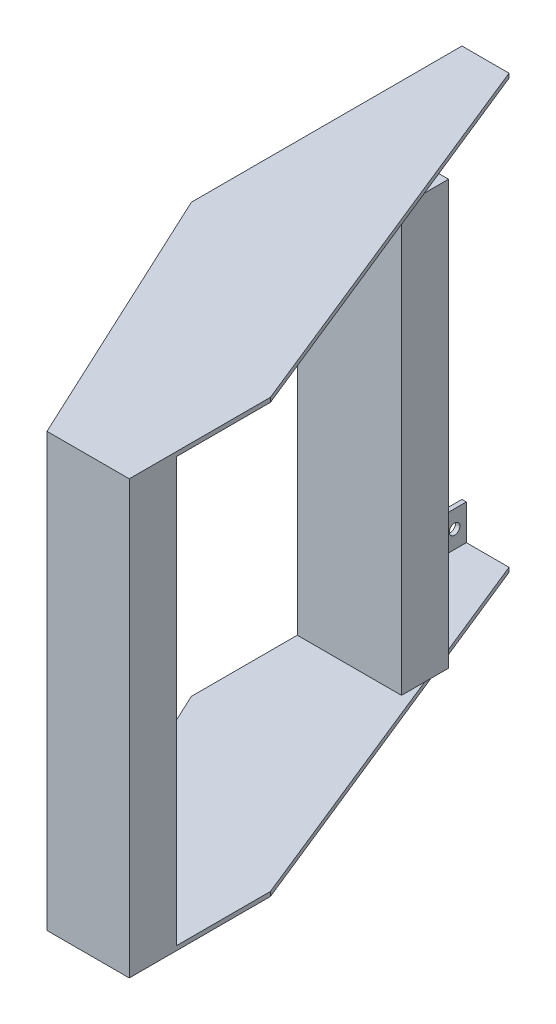
ISO-10303-21;
HEADER;
FILE_DESCRIPTION(('STEP AP214'),'2;1');
FILE_NAME('part.step','',(''),(''),'','','');
FILE_SCHEMA(('AUTOMOTIVE_DESIGN { 1 0 10303 214 1 1 1 1 }'));
ENDSEC;
DATA;
#1=APPLICATION_CONTEXT('core data for automotive mechanical design processes');
#2=APPLICATION_PROTOCOL_DEFINITION('international standard','automotive_design',2000,#1);
#3=PRODUCT_CONTEXT('',#1,'mechanical');
#4=PRODUCT('Part','Part','',(#3));
#5=PRODUCT_RELATED_PRODUCT_CATEGORY('part','',(#4));
#6=PRODUCT_DEFINITION_FORMATION('','',#4);
#7=PRODUCT_DEFINITION_CONTEXT('part definition',#1,'design');
#8=PRODUCT_DEFINITION('design','',#6,#7);
#9=PRODUCT_DEFINITION_SHAPE('','',#8);
#10=(LENGTH_UNIT() NAMED_UNIT(*) SI_UNIT(.MILLI.,.METRE.));
#11=(NAMED_UNIT(*) PLANE_ANGLE_UNIT() SI_UNIT($,.RADIAN.));
#12=(NAMED_UNIT(*) SI_UNIT($,.STERADIAN.) SOLID_ANGLE_UNIT());
#13=UNCERTAINTY_MEASURE_WITH_UNIT(LENGTH_MEASURE(1.E-05),#10,'distance_accuracy_value','');
#14=(GEOMETRIC_REPRESENTATION_CONTEXT(3) GLOBAL_UNCERTAINTY_ASSIGNED_CONTEXT((#13)) GLOBAL_UNIT_ASSIGNED_CONTEXT((#10,
#11,#12)) REPRESENTATION_CONTEXT('',''));
#15=CARTESIAN_POINT('',(0.,0.,0.));
#16=DIRECTION('',(0.,0.,1.));
#17=DIRECTION('',(1.,0.,0.));
#18=AXIS2_PLACEMENT_3D('',#15,#16,#17);
#19=CARTESIAN_POINT('',(0.,4.7498,0.));
#20=DIRECTION('',(0.,1.,0.));
#21=DIRECTION('',(0.,0.,1.));
#22=AXIS2_PLACEMENT_3D('',#19,#20,#21);
#23=PLANE('',#22);
#24=DIRECTION('',(0.422618261740695,0.,0.906307787036652));
#25=VECTOR('',#24,1.);
#26=CARTESIAN_POINT('',(23.6864669470732,4.7498,292.1));
#27=LINE('',#26,#25);
#28=CARTESIAN_POINT('',(-112.522000000001,4.7498,-1.16416580186276E-12));
#29=VERTEX_POINT('',#28);
#30=CARTESIAN_POINT('',(23.6864669470732,4.7498,292.1));
#31=VERTEX_POINT('',#30);
#32=EDGE_CURVE('E459',#29,#31,#27,.T.);
#33=ORIENTED_EDGE('',*,*,#32,.T.);
#34=DIRECTION('',(0.,0.,1.));
#35=VECTOR('',#34,1.);
#36=CARTESIAN_POINT('',(23.6864669470732,4.7498,292.1));
#37=LINE('',#36,#35);
#38=CARTESIAN_POINT('',(23.6864669470732,4.7498,241.3));
#39=VERTEX_POINT('',#38);
#40=EDGE_CURVE('E372',#39,#31,#37,.T.);
#41=ORIENTED_EDGE('',*,*,#40,.F.);
#42=DIRECTION('',(-1.,0.,0.));
#43=VECTOR('',#42,1.);
#44=CARTESIAN_POINT('',(23.6864669470732,4.7498,241.3));
#45=LINE('',#44,#43);
#46=CARTESIAN_POINT('',(112.522,4.7498,241.3));
#47=VERTEX_POINT('',#46);
#48=EDGE_CURVE('E218',#47,#39,#45,.T.);
#49=ORIENTED_EDGE('',*,*,#48,.F.);
#50=DIRECTION('',(0.,0.,-1.));
#51=VECTOR('',#50,1.);
#52=CARTESIAN_POINT('',(112.522,4.7498,292.099999999996));
#53=LINE('',#52,#51);
#54=CARTESIAN_POINT('',(112.521999999999,4.7498,139.7));
#55=VERTEX_POINT('',#54);
#56=EDGE_CURVE('E463',#47,#55,#53,.T.);
#57=ORIENTED_EDGE('',*,*,#56,.T.);
#58=DIRECTION('',(-0.37421049431943,0.,-0.927343790587508));
#59=VECTOR('',#58,1.);
#60=CARTESIAN_POINT('',(-61.7220000000018,4.7498,-292.100000000003));
#61=LINE('',#60,#59);
#62=CARTESIAN_POINT('',(0.,4.7498,-139.144606413993));
#63=VERTEX_POINT('',#62);
#64=EDGE_CURVE('E467',#55,#63,#61,.T.);
#65=ORIENTED_EDGE('',*,*,#64,.T.);
#66=DIRECTION('',(0.,0.,-1.));
#67=VECTOR('',#66,1.);
#68=CARTESIAN_POINT('',(0.,4.7498,-165.100000000003));
#69=LINE('',#68,#67);
#70=CARTESIAN_POINT('',(0.,4.7498,-114.300000000003));
#71=VERTEX_POINT('',#70);
#72=EDGE_CURVE('E428',#71,#63,#69,.T.);
#73=ORIENTED_EDGE('',*,*,#72,.F.);
#74=DIRECTION('',(1.,0.,0.));
#75=VECTOR('',#74,1.);
#76=CARTESIAN_POINT('',(-112.522000000001,4.7498,-114.300000000003));
#77=LINE('',#76,#75);
#78=CARTESIAN_POINT('',(-112.522000000001,4.7498,-114.300000000003));
#79=VERTEX_POINT('',#78);
#80=EDGE_CURVE('E416',#79,#71,#77,.T.);
#81=ORIENTED_EDGE('',*,*,#80,.F.);
#82=DIRECTION('',(0.,0.,1.));
#83=VECTOR('',#82,1.);
#84=CARTESIAN_POINT('',(-112.522000000001,4.7498,-1.16416580186276E-12));
#85=LINE('',#84,#83);
#86=EDGE_CURVE('E455',#79,#29,#85,.T.);
#87=ORIENTED_EDGE('',*,*,#86,.T.);
#88=EDGE_LOOP('',(#33,#41,#49,#57,#65,#73,#81,#87));
#89=FACE_BOUND('',#88,.T.);
#90=ADVANCED_FACE('F51',(#89),#23,.T.);
#91=DIRECTION('',(-1.,0.,0.));
#92=VECTOR('',#91,1.);
#93=CARTESIAN_POINT('',(-112.522000000001,4.7498,-292.100000000003));
#94=LINE('',#93,#92);
#95=CARTESIAN_POINT('',(-61.7220000000018,4.7498,-292.100000000003));
#96=VERTEX_POINT('',#95);
#97=CARTESIAN_POINT('',(-107.772200000001,4.7498,-292.100000000003));
#98=VERTEX_POINT('',#97);
#99=EDGE_CURVE('E451',#96,#98,#94,.T.);
#100=ORIENTED_EDGE('',*,*,#99,.T.);
#101=DIRECTION('',(0.,0.,-1.));
#102=VECTOR('',#101,1.);
#103=CARTESIAN_POINT('',(-107.772200000001,4.7498,0.));
#104=LINE('',#103,#102);
#105=CARTESIAN_POINT('',(-107.772200000001,4.7498,-165.100000000003));
#106=VERTEX_POINT('',#105);
#107=EDGE_CURVE('E387',#106,#98,#104,.T.);
#108=ORIENTED_EDGE('',*,*,#107,.F.);
#109=DIRECTION('',(-1.,0.,0.));
#110=VECTOR('',#109,1.);
#111=CARTESIAN_POINT('',(-112.522000000001,4.7498,-165.100000000003));
#112=LINE('',#111,#110);
#113=CARTESIAN_POINT('',(-10.4737647058841,4.7498,-165.100000000003));
#114=VERTEX_POINT('',#113);
#115=EDGE_CURVE('E11',#114,#106,#112,.T.);
#116=ORIENTED_EDGE('',*,*,#115,.F.);
#117=EDGE_CURVE('E466',#114,#96,#61,.T.);
#118=ORIENTED_EDGE('',*,*,#117,.T.);
#119=EDGE_LOOP('',(#100,#108,#116,#118));
#120=FACE_BOUND('',#119,.T.);
#121=ADVANCED_FACE('F587',(#120),#23,.T.);
#122=CARTESIAN_POINT('',(-112.522000000001,4.7498,-292.100000000003));
#123=DIRECTION('',(0.,0.,1.));
#124=DIRECTION('',(1.,0.,0.));
#125=AXIS2_PLACEMENT_3D('',#122,#123,#124);
#126=PLANE('',#125);
#127=DIRECTION('',(-1.,0.,0.));
#128=VECTOR('',#127,1.);
#129=CARTESIAN_POINT('',(-112.522000000001,0.,-292.100000000003));
#130=LINE('',#129,#128);
#131=CARTESIAN_POINT('',(-61.7220000000018,0.,-292.100000000003));
#132=VERTEX_POINT('',#131);
#133=CARTESIAN_POINT('',(-112.522000000001,0.,-292.100000000003));
#134=VERTEX_POINT('',#133);
#135=EDGE_CURVE('E450',#132,#134,#130,.T.);
#136=ORIENTED_EDGE('',*,*,#135,.T.);
#137=DIRECTION('',(0.,-1.,0.));
#138=VECTOR('',#137,1.);
#139=CARTESIAN_POINT('',(-112.522000000001,4.7498,-292.100000000003));
#140=LINE('',#139,#138);
#141=CARTESIAN_POINT('',(-112.522000000001,42.8498,-292.100000000003));
#142=VERTEX_POINT('',#141);
#143=EDGE_CURVE('E55',#142,#134,#140,.T.);
#144=ORIENTED_EDGE('',*,*,#143,.F.);
#145=DIRECTION('',(-1.,0.,0.));
#146=VECTOR('',#145,1.);
#147=CARTESIAN_POINT('',(-107.772200000001,42.8498,-292.100000000003));
#148=LINE('',#147,#146);
#149=CARTESIAN_POINT('',(-107.772200000001,42.8498,-292.100000000003));
#150=VERTEX_POINT('',#149);
#151=EDGE_CURVE('E398',#150,#142,#148,.T.);
#152=ORIENTED_EDGE('',*,*,#151,.F.);
#153=DIRECTION('',(0.,1.,0.));
#154=VECTOR('',#153,1.);
#155=CARTESIAN_POINT('',(-107.772200000001,4.25585492772981E-13,-292.100000000003));
#156=LINE('',#155,#154);
#157=EDGE_CURVE('E384',#98,#150,#156,.T.);
#158=ORIENTED_EDGE('',*,*,#157,.F.);
#159=ORIENTED_EDGE('',*,*,#99,.F.);
#160=DIRECTION('',(0.,-1.,0.));
#161=VECTOR('',#160,1.);
#162=CARTESIAN_POINT('',(-61.7220000000018,4.7498,-292.100000000003));
#163=LINE('',#162,#161);
#164=EDGE_CURVE('E471',#96,#132,#163,.T.);
#165=ORIENTED_EDGE('',*,*,#164,.T.);
#166=EDGE_LOOP('',(#136,#144,#152,#158,#159,#165));
#167=FACE_BOUND('',#166,.T.);
#168=ADVANCED_FACE('F53',(#167),#126,.F.);
#169=CARTESIAN_POINT('',(-112.522000000001,4.7498,-1.16416580186276E-12));
#170=DIRECTION('',(1.,0.,0.));
#171=DIRECTION('',(0.,0.,-1.));
#172=AXIS2_PLACEMENT_3D('',#169,#170,#171);
#173=PLANE('',#172);
#174=DIRECTION('',(0.,0.,1.));
#175=VECTOR('',#174,1.);
#176=CARTESIAN_POINT('',(-112.522000000001,0.,-1.16416580186276E-12));
#177=LINE('',#176,#175);
#178=CARTESIAN_POINT('',(-112.522000000001,0.,-1.16416580186276E-12));
#179=VERTEX_POINT('',#178);
#180=EDGE_CURVE('E476',#134,#179,#177,.T.);
#181=ORIENTED_EDGE('',*,*,#180,.T.);
#182=DIRECTION('',(0.,-1.,0.));
#183=VECTOR('',#182,1.);
#184=CARTESIAN_POINT('',(-112.522000000001,4.7498,-1.16416580186276E-12));
#185=LINE('',#184,#183);
#186=EDGE_CURVE('E504',#29,#179,#185,.T.);
#187=ORIENTED_EDGE('',*,*,#186,.F.);
#188=ORIENTED_EDGE('',*,*,#86,.F.);
#189=DIRECTION('',(0.,-1.,0.));
#190=VECTOR('',#189,1.);
#191=CARTESIAN_POINT('',(-112.522000000001,233.3498,-114.300000000003));
#192=LINE('',#191,#190);
#193=CARTESIAN_POINT('',(-112.522000000001,461.9498,-114.300000000003));
#194=VERTEX_POINT('',#193);
#195=EDGE_CURVE('E446',#194,#79,#192,.T.);
#196=ORIENTED_EDGE('',*,*,#195,.F.);
#197=DIRECTION('',(0.,0.,1.));
#198=VECTOR('',#197,1.);
#199=CARTESIAN_POINT('',(-112.522000000001,461.9498,-1.16416580186276E-12));
#200=LINE('',#199,#198);
#201=CARTESIAN_POINT('',(-112.522000000001,461.9498,-1.16416580186276E-12));
#202=VERTEX_POINT('',#201);
#203=EDGE_CURVE('E309',#194,#202,#200,.T.);
#204=ORIENTED_EDGE('',*,*,#203,.T.);
#205=DIRECTION('',(0.,1.,0.));
#206=VECTOR('',#205,1.);
#207=CARTESIAN_POINT('',(-112.522000000001,461.9498,-1.16416580186276E-12));
#208=LINE('',#207,#206);
#209=CARTESIAN_POINT('',(-112.522000000001,466.6996,-1.16416580186276E-12));
#210=VERTEX_POINT('',#209);
#211=EDGE_CURVE('E358',#202,#210,#208,.T.);
#212=ORIENTED_EDGE('',*,*,#211,.T.);
#213=DIRECTION('',(0.,0.,1.));
#214=VECTOR('',#213,1.);
#215=CARTESIAN_POINT('',(-112.522000000001,466.6996,-1.16416580186276E-12));
#216=LINE('',#215,#214);
#217=CARTESIAN_POINT('',(-112.522000000001,466.6996,-292.100000000003));
#218=VERTEX_POINT('',#217);
#219=EDGE_CURVE('E329',#218,#210,#216,.T.);
#220=ORIENTED_EDGE('',*,*,#219,.F.);
#221=DIRECTION('',(0.,1.,0.));
#222=VECTOR('',#221,1.);
#223=CARTESIAN_POINT('',(-112.522000000001,461.9498,-292.100000000003));
#224=LINE('',#223,#222);
#225=CARTESIAN_POINT('',(-112.522000000001,423.8498,-292.100000000003));
#226=VERTEX_POINT('',#225);
#227=EDGE_CURVE('E362',#226,#218,#224,.T.);
#228=ORIENTED_EDGE('',*,*,#227,.F.);
#229=DIRECTION('',(0.,0.,1.));
#230=VECTOR('',#229,1.);
#231=CARTESIAN_POINT('',(-112.522000000001,423.8498,0.));
#232=LINE('',#231,#230);
#233=CARTESIAN_POINT('',(-112.522000000001,423.8498,-219.512439056878));
#234=VERTEX_POINT('',#233);
#235=EDGE_CURVE('E270',#226,#234,#232,.T.);
#236=ORIENTED_EDGE('',*,*,#235,.T.);
#237=DIRECTION('',(0.,-0.573576436351042,-0.819152044288995));
#238=VECTOR('',#237,1.);
#239=CARTESIAN_POINT('',(-112.522000000001,541.084062207494,-52.0845611633618));
#240=LINE('',#239,#238);
#241=CARTESIAN_POINT('',(-112.522000000001,461.9498,-165.100000000003));
#242=VERTEX_POINT('',#241);
#243=EDGE_CURVE('E274',#242,#234,#240,.T.);
#244=ORIENTED_EDGE('',*,*,#243,.F.);
#245=DIRECTION('',(0.,-1.,0.));
#246=VECTOR('',#245,1.);
#247=CARTESIAN_POINT('',(-112.522000000001,233.3498,-165.100000000003));
#248=LINE('',#247,#246);
#249=CARTESIAN_POINT('',(-112.522000000001,4.7498,-165.100000000003));
#250=VERTEX_POINT('',#249);
#251=EDGE_CURVE('E434',#242,#250,#248,.T.);
#252=ORIENTED_EDGE('',*,*,#251,.T.);
#253=DIRECTION('',(0.,0.573576436351042,-0.819152044288995));
#254=VECTOR('',#253,1.);
#255=CARTESIAN_POINT('',(-112.522000000001,-74.3844622074936,-52.0845611633618));
#256=LINE('',#255,#254);
#257=CARTESIAN_POINT('',(-112.522000000001,42.8498,-219.512439056878));
#258=VERTEX_POINT('',#257);
#259=EDGE_CURVE('E406',#250,#258,#256,.T.);
#260=ORIENTED_EDGE('',*,*,#259,.T.);
#261=DIRECTION('',(0.,0.,1.));
#262=VECTOR('',#261,1.);
#263=CARTESIAN_POINT('',(-112.522000000001,42.8497999999999,0.));
#264=LINE('',#263,#262);
#265=EDGE_CURVE('E402',#142,#258,#264,.T.);
#266=ORIENTED_EDGE('',*,*,#265,.F.);
#267=ORIENTED_EDGE('',*,*,#143,.T.);
#268=EDGE_LOOP('',(#181,#187,#188,#196,#204,#212,#220,#228,#236,#244,#252,#260,#266,#267));
#269=FACE_BOUND('',#268,.T.);
#270=CARTESIAN_POINT('',(-112.522000000001,23.7998,-279.400000000003));
#271=DIRECTION('',(-1.,0.,0.));
#272=DIRECTION('',(0.,0.,1.));
#273=AXIS2_PLACEMENT_3D('',#270,#271,#272);
#274=CIRCLE('',#273,5.71500000000004);
#275=CARTESIAN_POINT('',(-112.522000000001,23.7998,-273.685000000003));
#276=VERTEX_POINT('',#275);
#277=EDGE_CURVE('E375',#276,#276,#274,.F.);
#278=ORIENTED_EDGE('',*,*,#277,.T.);
#279=EDGE_LOOP('',(#278));
#280=FACE_BOUND('',#279,.T.);
#281=CARTESIAN_POINT('',(-112.522000000001,23.7998,-228.600000000003));
#282=DIRECTION('',(-1.,0.,0.));
#283=DIRECTION('',(0.,0.,1.));
#284=AXIS2_PLACEMENT_3D('',#281,#282,#283);
#285=CIRCLE('',#284,5.71499999999998);
#286=CARTESIAN_POINT('',(-112.522000000001,23.7998,-222.885000000003));
#287=VERTEX_POINT('',#286);
#288=EDGE_CURVE('E381',#287,#287,#285,.F.);
#289=ORIENTED_EDGE('',*,*,#288,.T.);
#290=EDGE_LOOP('',(#289));
#291=FACE_BOUND('',#290,.T.);
#292=CARTESIAN_POINT('',(-112.522000000001,442.8998,-279.400000000003));
#293=DIRECTION('',(1.,0.,0.));
#294=DIRECTION('',(0.,0.,1.));
#295=AXIS2_PLACEMENT_3D('',#292,#293,#294);
#296=CIRCLE('',#295,5.71500000000004);
#297=CARTESIAN_POINT('',(-112.522000000001,442.8998,-273.685000000003));
#298=VERTEX_POINT('',#297);
#299=EDGE_CURVE('E233',#298,#298,#296,.F.);
#300=ORIENTED_EDGE('',*,*,#299,.F.);
#301=EDGE_LOOP('',(#300));
#302=FACE_BOUND('',#301,.T.);
#303=CARTESIAN_POINT('',(-112.522000000001,442.8998,-228.600000000003));
#304=DIRECTION('',(1.,0.,0.));
#305=DIRECTION('',(0.,0.,1.));
#306=AXIS2_PLACEMENT_3D('',#303,#304,#305);
#307=CIRCLE('',#306,5.71499999999998);
#308=CARTESIAN_POINT('',(-112.522000000001,442.8998,-222.885000000003));
#309=VERTEX_POINT('',#308);
#310=EDGE_CURVE('E247',#309,#309,#307,.F.);
#311=ORIENTED_EDGE('',*,*,#310,.F.);
#312=EDGE_LOOP('',(#311));
#313=FACE_BOUND('',#312,.T.);
#314=ADVANCED_FACE('F515',(#269,#280,#291,#302,#313),#173,.F.);
#315=CARTESIAN_POINT('',(23.6864669470732,4.7498,292.1));
#316=DIRECTION('',(0.906307787036652,0.,-0.422618261740695));
#317=DIRECTION('',(-0.422618261740695,0.,-0.906307787036652));
#318=AXIS2_PLACEMENT_3D('',#315,#316,#317);
#319=PLANE('',#318);
#320=DIRECTION('',(0.422618261740695,0.,0.906307787036652));
#321=VECTOR('',#320,1.);
#322=CARTESIAN_POINT('',(23.6864669470732,0.,292.1));
#323=LINE('',#322,#321);
#324=CARTESIAN_POINT('',(23.6864669470732,0.,292.1));
#325=VERTEX_POINT('',#324);
#326=EDGE_CURVE('E479',#179,#325,#323,.T.);
#327=ORIENTED_EDGE('',*,*,#326,.T.);
#328=DIRECTION('',(0.,-1.,0.));
#329=VECTOR('',#328,1.);
#330=CARTESIAN_POINT('',(23.6864669470732,4.7498,292.1));
#331=LINE('',#330,#329);
#332=EDGE_CURVE('E501',#31,#325,#331,.T.);
#333=ORIENTED_EDGE('',*,*,#332,.F.);
#334=ORIENTED_EDGE('',*,*,#32,.F.);
#335=ORIENTED_EDGE('',*,*,#186,.T.);
#336=EDGE_LOOP('',(#327,#333,#334,#335));
#337=FACE_BOUND('',#336,.T.);
#338=ADVANCED_FACE('F528',(#337),#319,.F.);
#339=CARTESIAN_POINT('',(23.6864669470732,4.7498,292.1));
#340=DIRECTION('',(0.,0.,-1.));
#341=DIRECTION('',(-1.,0.,0.));
#342=AXIS2_PLACEMENT_3D('',#339,#340,#341);
#343=PLANE('',#342);
#344=DIRECTION('',(1.,0.,0.));
#345=VECTOR('',#344,1.);
#346=CARTESIAN_POINT('',(23.6864669470732,0.,292.1));
#347=LINE('',#346,#345);
#348=CARTESIAN_POINT('',(112.522,0.,292.099999999996));
#349=VERTEX_POINT('',#348);
#350=EDGE_CURVE('E482',#325,#349,#347,.T.);
#351=ORIENTED_EDGE('',*,*,#350,.T.);
#352=DIRECTION('',(0.,-1.,0.));
#353=VECTOR('',#352,1.);
#354=CARTESIAN_POINT('',(112.522,4.7498,292.099999999996));
#355=LINE('',#354,#353);
#356=CARTESIAN_POINT('',(112.522,466.6996,292.099999999996));
#357=VERTEX_POINT('',#356);
#358=EDGE_CURVE('E497',#357,#349,#355,.T.);
#359=ORIENTED_EDGE('',*,*,#358,.F.);
#360=DIRECTION('',(1.,0.,0.));
#361=VECTOR('',#360,1.);
#362=CARTESIAN_POINT('',(23.6864669470732,466.6996,292.1));
#363=LINE('',#362,#361);
#364=CARTESIAN_POINT('',(23.6864669470732,466.6996,292.1));
#365=VERTEX_POINT('',#364);
#366=EDGE_CURVE('E337',#365,#357,#363,.T.);
#367=ORIENTED_EDGE('',*,*,#366,.F.);
#368=DIRECTION('',(0.,1.,0.));
#369=VECTOR('',#368,1.);
#370=CARTESIAN_POINT('',(23.6864669470732,461.9498,292.1));
#371=LINE('',#370,#369);
#372=CARTESIAN_POINT('',(23.6864669470732,461.9498,292.1));
#373=VERTEX_POINT('',#372);
#374=EDGE_CURVE('E354',#373,#365,#371,.T.);
#375=ORIENTED_EDGE('',*,*,#374,.F.);
#376=DIRECTION('',(0.,-1.,0.));
#377=VECTOR('',#376,1.);
#378=CARTESIAN_POINT('',(23.6864669470732,233.3498,292.1));
#379=LINE('',#378,#377);
#380=EDGE_CURVE('E227',#373,#31,#379,.T.);
#381=ORIENTED_EDGE('',*,*,#380,.T.);
#382=ORIENTED_EDGE('',*,*,#332,.T.);
#383=EDGE_LOOP('',(#351,#359,#367,#375,#381,#382));
#384=FACE_BOUND('',#383,.T.);
#385=ADVANCED_FACE('F530',(#384),#343,.F.);
#386=CARTESIAN_POINT('',(112.522,4.7498,292.099999999996));
#387=DIRECTION('',(-1.,0.,0.));
#388=DIRECTION('',(0.,0.,1.));
#389=AXIS2_PLACEMENT_3D('',#386,#387,#388);
#390=PLANE('',#389);
#391=DIRECTION('',(0.,0.,-1.));
#392=VECTOR('',#391,1.);
#393=CARTESIAN_POINT('',(112.522,0.,292.099999999996));
#394=LINE('',#393,#392);
#395=CARTESIAN_POINT('',(112.521999999999,0.,139.7));
#396=VERTEX_POINT('',#395);
#397=EDGE_CURVE('E485',#349,#396,#394,.T.);
#398=ORIENTED_EDGE('',*,*,#397,.T.);
#399=DIRECTION('',(0.,-1.,0.));
#400=VECTOR('',#399,1.);
#401=CARTESIAN_POINT('',(112.521999999999,4.7498,139.7));
#402=LINE('',#401,#400);
#403=EDGE_CURVE('E493',#55,#396,#402,.T.);
#404=ORIENTED_EDGE('',*,*,#403,.F.);
#405=ORIENTED_EDGE('',*,*,#56,.F.);
#406=DIRECTION('',(0.,-1.,0.));
#407=VECTOR('',#406,1.);
#408=CARTESIAN_POINT('',(112.522,233.3498,241.3));
#409=LINE('',#408,#407);
#410=CARTESIAN_POINT('',(112.522,461.9498,241.3));
#411=VERTEX_POINT('',#410);
#412=EDGE_CURVE('E69',#411,#47,#409,.T.);
#413=ORIENTED_EDGE('',*,*,#412,.F.);
#414=DIRECTION('',(0.,0.,-1.));
#415=VECTOR('',#414,1.);
#416=CARTESIAN_POINT('',(112.522,461.9498,292.099999999996));
#417=LINE('',#416,#415);
#418=CARTESIAN_POINT('',(112.521999999999,461.9498,139.7));
#419=VERTEX_POINT('',#418);
#420=EDGE_CURVE('E238',#411,#419,#417,.T.);
#421=ORIENTED_EDGE('',*,*,#420,.T.);
#422=DIRECTION('',(0.,1.,0.));
#423=VECTOR('',#422,1.);
#424=CARTESIAN_POINT('',(112.521999999999,461.9498,139.7));
#425=LINE('',#424,#423);
#426=CARTESIAN_POINT('',(112.521999999999,466.6996,139.7));
#427=VERTEX_POINT('',#426);
#428=EDGE_CURVE('E350',#419,#427,#425,.T.);
#429=ORIENTED_EDGE('',*,*,#428,.T.);
#430=DIRECTION('',(0.,0.,-1.));
#431=VECTOR('',#430,1.);
#432=CARTESIAN_POINT('',(112.522,466.6996,292.099999999996));
#433=LINE('',#432,#431);
#434=EDGE_CURVE('E341',#357,#427,#433,.T.);
#435=ORIENTED_EDGE('',*,*,#434,.F.);
#436=ORIENTED_EDGE('',*,*,#358,.T.);
#437=EDGE_LOOP('',(#398,#404,#405,#413,#421,#429,#435,#436));
#438=FACE_BOUND('',#437,.T.);
#439=ADVANCED_FACE('F626',(#438),#390,.F.);
#440=CARTESIAN_POINT('',(-61.7220000000018,4.7498,-292.100000000003));
#441=DIRECTION('',(-0.927343790587508,0.,0.37421049431943));
#442=DIRECTION('',(0.37421049431943,0.,0.927343790587508));
#443=AXIS2_PLACEMENT_3D('',#440,#441,#442);
#444=PLANE('',#443);
#445=DIRECTION('',(-0.37421049431943,0.,-0.927343790587508));
#446=VECTOR('',#445,1.);
#447=CARTESIAN_POINT('',(-61.7220000000018,0.,-292.100000000003));
#448=LINE('',#447,#446);
#449=EDGE_CURVE('E456',#396,#132,#448,.T.);
#450=ORIENTED_EDGE('',*,*,#449,.T.);
#451=ORIENTED_EDGE('',*,*,#164,.F.);
#452=ORIENTED_EDGE('',*,*,#117,.F.);
#453=EDGE_CURVE('E472',#63,#114,#61,.T.);
#454=ORIENTED_EDGE('',*,*,#453,.F.);
#455=ORIENTED_EDGE('',*,*,#64,.F.);
#456=ORIENTED_EDGE('',*,*,#403,.T.);
#457=EDGE_LOOP('',(#450,#451,#452,#454,#455,#456));
#458=FACE_BOUND('',#457,.T.);
#459=ADVANCED_FACE('F588',(#458),#444,.F.);
#460=CARTESIAN_POINT('',(0.,0.,0.));
#461=DIRECTION('',(0.,1.,0.));
#462=DIRECTION('',(0.,0.,1.));
#463=AXIS2_PLACEMENT_3D('',#460,#461,#462);
#464=PLANE('',#463);
#465=ORIENTED_EDGE('',*,*,#135,.F.);
#466=ORIENTED_EDGE('',*,*,#449,.F.);
#467=ORIENTED_EDGE('',*,*,#397,.F.);
#468=ORIENTED_EDGE('',*,*,#350,.F.);
#469=ORIENTED_EDGE('',*,*,#326,.F.);
#470=ORIENTED_EDGE('',*,*,#180,.F.);
#471=EDGE_LOOP('',(#465,#466,#467,#468,#469,#470));
#472=FACE_BOUND('',#471,.T.);
#473=ADVANCED_FACE('F524',(#472),#464,.F.);
#474=CARTESIAN_POINT('',(0.,4.7498,0.));
#475=DIRECTION('',(0.,1.,0.));
#476=DIRECTION('',(0.,0.,1.));
#477=AXIS2_PLACEMENT_3D('',#474,#475,#476);
#478=PLANE('',#477);
#479=CARTESIAN_POINT('',(0.,4.7498,-165.100000000003));
#480=VERTEX_POINT('',#479);
#481=EDGE_CURVE('E427',#63,#480,#69,.T.);
#482=ORIENTED_EDGE('',*,*,#481,.F.);
#483=ORIENTED_EDGE('',*,*,#453,.T.);
#484=EDGE_CURVE('E62',#480,#114,#112,.T.);
#485=ORIENTED_EDGE('',*,*,#484,.F.);
#486=EDGE_LOOP('',(#482,#483,#485));
#487=FACE_BOUND('',#486,.T.);
#488=ADVANCED_FACE('F582',(#487),#478,.F.);
#489=CARTESIAN_POINT('',(-112.522000000001,233.3498,-114.300000000003));
#490=DIRECTION('',(0.,0.,-1.));
#491=DIRECTION('',(-1.,0.,0.));
#492=AXIS2_PLACEMENT_3D('',#489,#490,#491);
#493=PLANE('',#492);
#494=ORIENTED_EDGE('',*,*,#80,.T.);
#495=DIRECTION('',(0.,-1.,0.));
#496=VECTOR('',#495,1.);
#497=CARTESIAN_POINT('',(0.,233.3498,-114.300000000003));
#498=LINE('',#497,#496);
#499=CARTESIAN_POINT('',(0.,461.9498,-114.300000000003));
#500=VERTEX_POINT('',#499);
#501=EDGE_CURVE('E442',#500,#71,#498,.T.);
#502=ORIENTED_EDGE('',*,*,#501,.F.);
#503=DIRECTION('',(1.,0.,0.));
#504=VECTOR('',#503,1.);
#505=CARTESIAN_POINT('',(-112.522000000001,461.9498,-114.300000000003));
#506=LINE('',#505,#504);
#507=EDGE_CURVE('E284',#194,#500,#506,.T.);
#508=ORIENTED_EDGE('',*,*,#507,.F.);
#509=ORIENTED_EDGE('',*,*,#195,.T.);
#510=EDGE_LOOP('',(#494,#502,#508,#509));
#511=FACE_BOUND('',#510,.T.);
#512=ADVANCED_FACE('F535',(#511),#493,.F.);
#513=CARTESIAN_POINT('',(0.,233.3498,-165.100000000003));
#514=DIRECTION('',(-1.,0.,0.));
#515=DIRECTION('',(0.,0.,1.));
#516=AXIS2_PLACEMENT_3D('',#513,#514,#515);
#517=PLANE('',#516);
#518=ORIENTED_EDGE('',*,*,#72,.T.);
#519=ORIENTED_EDGE('',*,*,#481,.T.);
#520=DIRECTION('',(0.,-1.,0.));
#521=VECTOR('',#520,1.);
#522=CARTESIAN_POINT('',(0.,233.3498,-165.100000000003));
#523=LINE('',#522,#521);
#524=CARTESIAN_POINT('',(0.,461.9498,-165.100000000003));
#525=VERTEX_POINT('',#524);
#526=EDGE_CURVE('E438',#525,#480,#523,.T.);
#527=ORIENTED_EDGE('',*,*,#526,.F.);
#528=DIRECTION('',(0.,0.,-1.));
#529=VECTOR('',#528,1.);
#530=CARTESIAN_POINT('',(0.,461.9498,-165.100000000003));
#531=LINE('',#530,#529);
#532=CARTESIAN_POINT('',(0.,461.9498,-139.144606413993));
#533=VERTEX_POINT('',#532);
#534=EDGE_CURVE('E295',#533,#525,#531,.T.);
#535=ORIENTED_EDGE('',*,*,#534,.F.);
#536=EDGE_CURVE('E296',#500,#533,#531,.T.);
#537=ORIENTED_EDGE('',*,*,#536,.F.);
#538=ORIENTED_EDGE('',*,*,#501,.T.);
#539=EDGE_LOOP('',(#518,#519,#527,#535,#537,#538));
#540=FACE_BOUND('',#539,.T.);
#541=ADVANCED_FACE('F577',(#540),#517,.F.);
#542=CARTESIAN_POINT('',(-112.522000000001,233.3498,-165.100000000003));
#543=DIRECTION('',(0.,0.,1.));
#544=DIRECTION('',(1.,0.,0.));
#545=AXIS2_PLACEMENT_3D('',#542,#543,#544);
#546=PLANE('',#545);
#547=ORIENTED_EDGE('',*,*,#484,.T.);
#548=ORIENTED_EDGE('',*,*,#115,.T.);
#549=DIRECTION('',(-1.,0.,0.));
#550=VECTOR('',#549,1.);
#551=CARTESIAN_POINT('',(-107.772200000001,4.7498,-165.100000000003));
#552=LINE('',#551,#550);
#553=EDGE_CURVE('E417',#106,#250,#552,.T.);
#554=ORIENTED_EDGE('',*,*,#553,.T.);
#555=ORIENTED_EDGE('',*,*,#251,.F.);
#556=DIRECTION('',(-1.,0.,0.));
#557=VECTOR('',#556,1.);
#558=CARTESIAN_POINT('',(-107.772200000001,461.9498,-165.100000000003));
#559=LINE('',#558,#557);
#560=CARTESIAN_POINT('',(-107.772200000001,461.9498,-165.100000000003));
#561=VERTEX_POINT('',#560);
#562=EDGE_CURVE('E285',#561,#242,#559,.T.);
#563=ORIENTED_EDGE('',*,*,#562,.F.);
#564=DIRECTION('',(-1.,0.,0.));
#565=VECTOR('',#564,1.);
#566=CARTESIAN_POINT('',(-112.522000000001,461.9498,-165.100000000003));
#567=LINE('',#566,#565);
#568=CARTESIAN_POINT('',(-10.4737647058841,461.9498,-165.100000000003));
#569=VERTEX_POINT('',#568);
#570=EDGE_CURVE('E304',#569,#561,#567,.T.);
#571=ORIENTED_EDGE('',*,*,#570,.F.);
#572=EDGE_CURVE('E300',#525,#569,#567,.T.);
#573=ORIENTED_EDGE('',*,*,#572,.F.);
#574=ORIENTED_EDGE('',*,*,#526,.T.);
#575=EDGE_LOOP('',(#547,#548,#554,#555,#563,#571,#573,#574));
#576=FACE_BOUND('',#575,.T.);
#577=ADVANCED_FACE('F557',(#576),#546,.F.);
#578=CARTESIAN_POINT('',(-107.772200000001,42.8497999999999,0.));
#579=DIRECTION('',(0.,-1.,0.));
#580=DIRECTION('',(0.,0.,-1.));
#581=AXIS2_PLACEMENT_3D('',#578,#579,#580);
#582=PLANE('',#581);
#583=ORIENTED_EDGE('',*,*,#265,.T.);
#584=DIRECTION('',(-1.,0.,0.));
#585=VECTOR('',#584,1.);
#586=CARTESIAN_POINT('',(-107.772200000001,42.8498,-219.512439056878));
#587=LINE('',#586,#585);
#588=CARTESIAN_POINT('',(-107.772200000001,42.8498,-219.512439056878));
#589=VERTEX_POINT('',#588);
#590=EDGE_CURVE('E413',#589,#258,#587,.T.);
#591=ORIENTED_EDGE('',*,*,#590,.F.);
#592=DIRECTION('',(0.,0.,1.));
#593=VECTOR('',#592,1.);
#594=CARTESIAN_POINT('',(-107.772200000001,42.8497999999999,0.));
#595=LINE('',#594,#593);
#596=EDGE_CURVE('E380',#150,#589,#595,.T.);
#597=ORIENTED_EDGE('',*,*,#596,.F.);
#598=ORIENTED_EDGE('',*,*,#151,.T.);
#599=EDGE_LOOP('',(#583,#591,#597,#598));
#600=FACE_BOUND('',#599,.T.);
#601=ADVANCED_FACE('F599',(#600),#582,.F.);
#602=CARTESIAN_POINT('',(-107.772200000001,-74.3844622074936,-52.0845611633618));
#603=DIRECTION('',(0.,0.819152044288995,0.573576436351042));
#604=DIRECTION('',(0.,-0.573576436351042,0.819152044288995));
#605=AXIS2_PLACEMENT_3D('',#602,#603,#604);
#606=PLANE('',#605);
#607=ORIENTED_EDGE('',*,*,#259,.F.);
#608=ORIENTED_EDGE('',*,*,#553,.F.);
#609=DIRECTION('',(0.,0.573576436351042,-0.819152044288995));
#610=VECTOR('',#609,1.);
#611=CARTESIAN_POINT('',(-107.772200000001,-74.3844622074936,-52.0845611633618));
#612=LINE('',#611,#610);
#613=EDGE_CURVE('E390',#106,#589,#612,.T.);
#614=ORIENTED_EDGE('',*,*,#613,.T.);
#615=ORIENTED_EDGE('',*,*,#590,.T.);
#616=EDGE_LOOP('',(#607,#608,#614,#615));
#617=FACE_BOUND('',#616,.T.);
#618=ADVANCED_FACE('F597',(#617),#606,.T.);
#619=CARTESIAN_POINT('',(-107.772200000001,23.7998,-279.400000000003));
#620=DIRECTION('',(-1.,0.,0.));
#621=DIRECTION('',(0.,0.,1.));
#622=AXIS2_PLACEMENT_3D('',#619,#620,#621);
#623=CYLINDRICAL_SURFACE('',#622,5.71500000000004);
#624=CARTESIAN_POINT('',(-107.772200000001,23.7998,-279.400000000003));
#625=DIRECTION('',(-1.,0.,0.));
#626=DIRECTION('',(0.,0.,1.));
#627=AXIS2_PLACEMENT_3D('',#624,#625,#626);
#628=CIRCLE('',#627,5.71500000000004);
#629=CARTESIAN_POINT('',(-107.772200000001,23.7998,-273.685000000003));
#630=VERTEX_POINT('',#629);
#631=EDGE_CURVE('E376',#630,#630,#628,.F.);
#632=ORIENTED_EDGE('',*,*,#631,.T.);
#633=EDGE_LOOP('',(#632));
#634=FACE_BOUND('',#633,.T.);
#635=ORIENTED_EDGE('',*,*,#277,.F.);
#636=EDGE_LOOP('',(#635));
#637=FACE_BOUND('',#636,.T.);
#638=ADVANCED_FACE('F607',(#634,#637),#623,.F.);
#639=CARTESIAN_POINT('',(-107.772200000001,23.7998,-228.600000000003));
#640=DIRECTION('',(-1.,0.,0.));
#641=DIRECTION('',(0.,0.,1.));
#642=AXIS2_PLACEMENT_3D('',#639,#640,#641);
#643=CYLINDRICAL_SURFACE('',#642,5.71499999999998);
#644=CARTESIAN_POINT('',(-107.772200000001,23.7998,-228.600000000003));
#645=DIRECTION('',(-1.,0.,0.));
#646=DIRECTION('',(0.,0.,1.));
#647=AXIS2_PLACEMENT_3D('',#644,#645,#646);
#648=CIRCLE('',#647,5.71499999999998);
#649=CARTESIAN_POINT('',(-107.772200000001,23.7998,-222.885000000003));
#650=VERTEX_POINT('',#649);
#651=EDGE_CURVE('E394',#650,#650,#648,.F.);
#652=ORIENTED_EDGE('',*,*,#651,.T.);
#653=EDGE_LOOP('',(#652));
#654=FACE_BOUND('',#653,.T.);
#655=ORIENTED_EDGE('',*,*,#288,.F.);
#656=EDGE_LOOP('',(#655));
#657=FACE_BOUND('',#656,.T.);
#658=ADVANCED_FACE('F687',(#654,#657),#643,.F.);
#659=CARTESIAN_POINT('',(-107.772200000001,0.,0.));
#660=DIRECTION('',(-1.,0.,0.));
#661=DIRECTION('',(0.,0.,1.));
#662=AXIS2_PLACEMENT_3D('',#659,#660,#661);
#663=PLANE('',#662);
#664=ORIENTED_EDGE('',*,*,#631,.F.);
#665=EDGE_LOOP('',(#664));
#666=FACE_BOUND('',#665,.T.);
#667=ORIENTED_EDGE('',*,*,#596,.T.);
#668=ORIENTED_EDGE('',*,*,#613,.F.);
#669=ORIENTED_EDGE('',*,*,#107,.T.);
#670=ORIENTED_EDGE('',*,*,#157,.T.);
#671=EDGE_LOOP('',(#667,#668,#669,#670));
#672=FACE_BOUND('',#671,.T.);
#673=ORIENTED_EDGE('',*,*,#651,.F.);
#674=EDGE_LOOP('',(#673));
#675=FACE_BOUND('',#674,.T.);
#676=ADVANCED_FACE('F592',(#666,#672,#675),#663,.F.);
#677=CARTESIAN_POINT('',(23.6864669470732,233.3498,292.1));
#678=DIRECTION('',(1.,0.,0.));
#679=DIRECTION('',(0.,0.,-1.));
#680=AXIS2_PLACEMENT_3D('',#677,#678,#679);
#681=PLANE('',#680);
#682=ORIENTED_EDGE('',*,*,#40,.T.);
#683=ORIENTED_EDGE('',*,*,#380,.F.);
#684=DIRECTION('',(0.,0.,1.));
#685=VECTOR('',#684,1.);
#686=CARTESIAN_POINT('',(23.6864669470732,461.9498,292.1));
#687=LINE('',#686,#685);
#688=CARTESIAN_POINT('',(23.6864669470732,461.9498,241.3));
#689=VERTEX_POINT('',#688);
#690=EDGE_CURVE('E225',#689,#373,#687,.T.);
#691=ORIENTED_EDGE('',*,*,#690,.F.);
#692=DIRECTION('',(0.,-1.,0.));
#693=VECTOR('',#692,1.);
#694=CARTESIAN_POINT('',(23.6864669470732,233.3498,241.3));
#695=LINE('',#694,#693);
#696=EDGE_CURVE('E212',#689,#39,#695,.T.);
#697=ORIENTED_EDGE('',*,*,#696,.T.);
#698=EDGE_LOOP('',(#682,#683,#691,#697));
#699=FACE_BOUND('',#698,.T.);
#700=ADVANCED_FACE('F226',(#699),#681,.F.);
#701=CARTESIAN_POINT('',(23.6864669470732,233.3498,241.3));
#702=DIRECTION('',(0.,0.,1.));
#703=DIRECTION('',(1.,0.,0.));
#704=AXIS2_PLACEMENT_3D('',#701,#702,#703);
#705=PLANE('',#704);
#706=ORIENTED_EDGE('',*,*,#48,.T.);
#707=ORIENTED_EDGE('',*,*,#696,.F.);
#708=DIRECTION('',(-1.,0.,0.));
#709=VECTOR('',#708,1.);
#710=CARTESIAN_POINT('',(23.6864669470732,461.9498,241.3));
#711=LINE('',#710,#709);
#712=EDGE_CURVE('E216',#411,#689,#711,.T.);
#713=ORIENTED_EDGE('',*,*,#712,.F.);
#714=ORIENTED_EDGE('',*,*,#412,.T.);
#715=EDGE_LOOP('',(#706,#707,#713,#714));
#716=FACE_BOUND('',#715,.T.);
#717=ADVANCED_FACE('F214',(#716),#705,.F.);
#718=CARTESIAN_POINT('',(0.,461.9498,0.));
#719=DIRECTION('',(0.,-1.,0.));
#720=DIRECTION('',(0.,0.,1.));
#721=AXIS2_PLACEMENT_3D('',#718,#719,#720);
#722=PLANE('',#721);
#723=DIRECTION('',(0.422618261740695,0.,0.906307787036652));
#724=VECTOR('',#723,1.);
#725=CARTESIAN_POINT('',(23.6864669470732,461.9498,292.1));
#726=LINE('',#725,#724);
#727=EDGE_CURVE('E314',#202,#373,#726,.T.);
#728=ORIENTED_EDGE('',*,*,#727,.F.);
#729=ORIENTED_EDGE('',*,*,#203,.F.);
#730=ORIENTED_EDGE('',*,*,#507,.T.);
#731=ORIENTED_EDGE('',*,*,#536,.T.);
#732=DIRECTION('',(-0.37421049431943,0.,-0.927343790587508));
#733=VECTOR('',#732,1.);
#734=CARTESIAN_POINT('',(-61.7220000000018,461.9498,-292.100000000003));
#735=LINE('',#734,#733);
#736=EDGE_CURVE('E320',#419,#533,#735,.T.);
#737=ORIENTED_EDGE('',*,*,#736,.F.);
#738=ORIENTED_EDGE('',*,*,#420,.F.);
#739=ORIENTED_EDGE('',*,*,#712,.T.);
#740=ORIENTED_EDGE('',*,*,#690,.T.);
#741=EDGE_LOOP('',(#728,#729,#730,#731,#737,#738,#739,#740));
#742=FACE_BOUND('',#741,.T.);
#743=ADVANCED_FACE('F235',(#742),#722,.T.);
#744=DIRECTION('',(-1.,0.,0.));
#745=VECTOR('',#744,1.);
#746=CARTESIAN_POINT('',(-112.522000000001,461.9498,-292.100000000003));
#747=LINE('',#746,#745);
#748=CARTESIAN_POINT('',(-61.7220000000018,461.9498,-292.100000000003));
#749=VERTEX_POINT('',#748);
#750=CARTESIAN_POINT('',(-107.772200000001,461.9498,-292.100000000003));
#751=VERTEX_POINT('',#750);
#752=EDGE_CURVE('E305',#749,#751,#747,.T.);
#753=ORIENTED_EDGE('',*,*,#752,.F.);
#754=EDGE_CURVE('E319',#569,#749,#735,.T.);
#755=ORIENTED_EDGE('',*,*,#754,.F.);
#756=ORIENTED_EDGE('',*,*,#570,.T.);
#757=DIRECTION('',(0.,0.,-1.));
#758=VECTOR('',#757,1.);
#759=CARTESIAN_POINT('',(-107.772200000001,461.9498,0.));
#760=LINE('',#759,#758);
#761=EDGE_CURVE('E255',#561,#751,#760,.T.);
#762=ORIENTED_EDGE('',*,*,#761,.T.);
#763=EDGE_LOOP('',(#753,#755,#756,#762));
#764=FACE_BOUND('',#763,.T.);
#765=ADVANCED_FACE('F566',(#764),#722,.T.);
#766=CARTESIAN_POINT('',(-112.522000000001,461.9498,-292.100000000003));
#767=DIRECTION('',(0.,0.,1.));
#768=DIRECTION('',(1.,0.,0.));
#769=AXIS2_PLACEMENT_3D('',#766,#767,#768);
#770=PLANE('',#769);
#771=DIRECTION('',(-1.,0.,0.));
#772=VECTOR('',#771,1.);
#773=CARTESIAN_POINT('',(-112.522000000001,466.6996,-292.100000000003));
#774=LINE('',#773,#772);
#775=CARTESIAN_POINT('',(-61.7220000000018,466.6996,-292.100000000003));
#776=VERTEX_POINT('',#775);
#777=EDGE_CURVE('E303',#776,#218,#774,.T.);
#778=ORIENTED_EDGE('',*,*,#777,.F.);
#779=DIRECTION('',(0.,1.,0.));
#780=VECTOR('',#779,1.);
#781=CARTESIAN_POINT('',(-61.7220000000018,461.9498,-292.100000000003));
#782=LINE('',#781,#780);
#783=EDGE_CURVE('E324',#749,#776,#782,.T.);
#784=ORIENTED_EDGE('',*,*,#783,.F.);
#785=ORIENTED_EDGE('',*,*,#752,.T.);
#786=DIRECTION('',(0.,-1.,0.));
#787=VECTOR('',#786,1.);
#788=CARTESIAN_POINT('',(-107.772200000001,466.6996,-292.100000000003));
#789=LINE('',#788,#787);
#790=CARTESIAN_POINT('',(-107.772200000001,423.8498,-292.100000000003));
#791=VERTEX_POINT('',#790);
#792=EDGE_CURVE('E251',#751,#791,#789,.T.);
#793=ORIENTED_EDGE('',*,*,#792,.T.);
#794=DIRECTION('',(-1.,0.,0.));
#795=VECTOR('',#794,1.);
#796=CARTESIAN_POINT('',(-107.772200000001,423.8498,-292.100000000003));
#797=LINE('',#796,#795);
#798=EDGE_CURVE('E266',#791,#226,#797,.T.);
#799=ORIENTED_EDGE('',*,*,#798,.T.);
#800=ORIENTED_EDGE('',*,*,#227,.T.);
#801=EDGE_LOOP('',(#778,#784,#785,#793,#799,#800));
#802=FACE_BOUND('',#801,.T.);
#803=ADVANCED_FACE('F544',(#802),#770,.F.);
#804=CARTESIAN_POINT('',(23.6864669470732,461.9498,292.1));
#805=DIRECTION('',(0.906307787036652,0.,-0.422618261740695));
#806=DIRECTION('',(-0.422618261740695,0.,-0.906307787036652));
#807=AXIS2_PLACEMENT_3D('',#804,#805,#806);
#808=PLANE('',#807);
#809=DIRECTION('',(0.422618261740695,0.,0.906307787036652));
#810=VECTOR('',#809,1.);
#811=CARTESIAN_POINT('',(23.6864669470732,466.6996,292.1));
#812=LINE('',#811,#810);
#813=EDGE_CURVE('E333',#210,#365,#812,.T.);
#814=ORIENTED_EDGE('',*,*,#813,.F.);
#815=ORIENTED_EDGE('',*,*,#211,.F.);
#816=ORIENTED_EDGE('',*,*,#727,.T.);
#817=ORIENTED_EDGE('',*,*,#374,.T.);
#818=EDGE_LOOP('',(#814,#815,#816,#817));
#819=FACE_BOUND('',#818,.T.);
#820=ADVANCED_FACE('F745',(#819),#808,.F.);
#821=CARTESIAN_POINT('',(-61.7220000000018,461.9498,-292.100000000003));
#822=DIRECTION('',(-0.927343790587508,0.,0.37421049431943));
#823=DIRECTION('',(0.37421049431943,0.,0.927343790587508));
#824=AXIS2_PLACEMENT_3D('',#821,#822,#823);
#825=PLANE('',#824);
#826=DIRECTION('',(-0.37421049431943,0.,-0.927343790587508));
#827=VECTOR('',#826,1.);
#828=CARTESIAN_POINT('',(-61.7220000000018,466.6996,-292.100000000003));
#829=LINE('',#828,#827);
#830=EDGE_CURVE('E310',#427,#776,#829,.T.);
#831=ORIENTED_EDGE('',*,*,#830,.F.);
#832=ORIENTED_EDGE('',*,*,#428,.F.);
#833=ORIENTED_EDGE('',*,*,#736,.T.);
#834=EDGE_CURVE('E325',#533,#569,#735,.T.);
#835=ORIENTED_EDGE('',*,*,#834,.T.);
#836=ORIENTED_EDGE('',*,*,#754,.T.);
#837=ORIENTED_EDGE('',*,*,#783,.T.);
#838=EDGE_LOOP('',(#831,#832,#833,#835,#836,#837));
#839=FACE_BOUND('',#838,.T.);
#840=ADVANCED_FACE('F754',(#839),#825,.F.);
#841=CARTESIAN_POINT('',(0.,466.6996,0.));
#842=DIRECTION('',(0.,-1.,0.));
#843=DIRECTION('',(0.,0.,1.));
#844=AXIS2_PLACEMENT_3D('',#841,#842,#843);
#845=PLANE('',#844);
#846=ORIENTED_EDGE('',*,*,#777,.T.);
#847=ORIENTED_EDGE('',*,*,#219,.T.);
#848=ORIENTED_EDGE('',*,*,#813,.T.);
#849=ORIENTED_EDGE('',*,*,#366,.T.);
#850=ORIENTED_EDGE('',*,*,#434,.T.);
#851=ORIENTED_EDGE('',*,*,#830,.T.);
#852=EDGE_LOOP('',(#846,#847,#848,#849,#850,#851));
#853=FACE_BOUND('',#852,.T.);
#854=ADVANCED_FACE('F541',(#853),#845,.F.);
#855=CARTESIAN_POINT('',(0.,461.9498,0.));
#856=DIRECTION('',(0.,-1.,0.));
#857=DIRECTION('',(0.,0.,1.));
#858=AXIS2_PLACEMENT_3D('',#855,#856,#857);
#859=PLANE('',#858);
#860=ORIENTED_EDGE('',*,*,#534,.T.);
#861=ORIENTED_EDGE('',*,*,#572,.T.);
#862=ORIENTED_EDGE('',*,*,#834,.F.);
#863=EDGE_LOOP('',(#860,#861,#862));
#864=FACE_BOUND('',#863,.T.);
#865=ADVANCED_FACE('F575',(#864),#859,.F.);
#866=CARTESIAN_POINT('',(-107.772200000001,423.8498,0.));
#867=DIRECTION('',(0.,1.,0.));
#868=DIRECTION('',(0.,0.,-1.));
#869=AXIS2_PLACEMENT_3D('',#866,#867,#868);
#870=PLANE('',#869);
#871=ORIENTED_EDGE('',*,*,#235,.F.);
#872=ORIENTED_EDGE('',*,*,#798,.F.);
#873=DIRECTION('',(0.,0.,1.));
#874=VECTOR('',#873,1.);
#875=CARTESIAN_POINT('',(-107.772200000001,423.8498,0.));
#876=LINE('',#875,#874);
#877=CARTESIAN_POINT('',(-107.772200000001,423.8498,-219.512439056878));
#878=VERTEX_POINT('',#877);
#879=EDGE_CURVE('E246',#791,#878,#876,.T.);
#880=ORIENTED_EDGE('',*,*,#879,.T.);
#881=DIRECTION('',(-1.,0.,0.));
#882=VECTOR('',#881,1.);
#883=CARTESIAN_POINT('',(-107.772200000001,423.8498,-219.512439056878));
#884=LINE('',#883,#882);
#885=EDGE_CURVE('E281',#878,#234,#884,.T.);
#886=ORIENTED_EDGE('',*,*,#885,.T.);
#887=EDGE_LOOP('',(#871,#872,#880,#886));
#888=FACE_BOUND('',#887,.T.);
#889=ADVANCED_FACE('F549',(#888),#870,.F.);
#890=CARTESIAN_POINT('',(-107.772200000001,541.084062207494,-52.0845611633618));
#891=DIRECTION('',(0.,-0.819152044288995,0.573576436351042));
#892=DIRECTION('',(0.,0.573576436351042,0.819152044288995));
#893=AXIS2_PLACEMENT_3D('',#890,#891,#892);
#894=PLANE('',#893);
#895=ORIENTED_EDGE('',*,*,#243,.T.);
#896=ORIENTED_EDGE('',*,*,#885,.F.);
#897=DIRECTION('',(0.,-0.573576436351042,-0.819152044288995));
#898=VECTOR('',#897,1.);
#899=CARTESIAN_POINT('',(-107.772200000001,541.084062207494,-52.0845611633618));
#900=LINE('',#899,#898);
#901=EDGE_CURVE('E259',#561,#878,#900,.T.);
#902=ORIENTED_EDGE('',*,*,#901,.F.);
#903=ORIENTED_EDGE('',*,*,#562,.T.);
#904=EDGE_LOOP('',(#895,#896,#902,#903));
#905=FACE_BOUND('',#904,.T.);
#906=ADVANCED_FACE('F552',(#905),#894,.T.);
#907=CARTESIAN_POINT('',(-107.772200000001,442.8998,-279.400000000003));
#908=DIRECTION('',(-1.,0.,0.));
#909=DIRECTION('',(0.,0.,1.));
#910=AXIS2_PLACEMENT_3D('',#907,#908,#909);
#911=CYLINDRICAL_SURFACE('',#910,5.71500000000004);
#912=CARTESIAN_POINT('',(-107.772200000001,442.8998,-279.400000000003));
#913=DIRECTION('',(1.,0.,0.));
#914=DIRECTION('',(0.,0.,1.));
#915=AXIS2_PLACEMENT_3D('',#912,#913,#914);
#916=CIRCLE('',#915,5.71500000000004);
#917=CARTESIAN_POINT('',(-107.772200000001,442.8998,-273.685000000003));
#918=VERTEX_POINT('',#917);
#919=EDGE_CURVE('E242',#918,#918,#916,.F.);
#920=ORIENTED_EDGE('',*,*,#919,.F.);
#921=EDGE_LOOP('',(#920));
#922=FACE_BOUND('',#921,.T.);
#923=ORIENTED_EDGE('',*,*,#299,.T.);
#924=EDGE_LOOP('',(#923));
#925=FACE_BOUND('',#924,.T.);
#926=ADVANCED_FACE('F791',(#922,#925),#911,.F.);
#927=CARTESIAN_POINT('',(-107.772200000001,442.8998,-228.600000000003));
#928=DIRECTION('',(-1.,0.,0.));
#929=DIRECTION('',(0.,0.,1.));
#930=AXIS2_PLACEMENT_3D('',#927,#928,#929);
#931=CYLINDRICAL_SURFACE('',#930,5.71499999999998);
#932=CARTESIAN_POINT('',(-107.772200000001,442.8998,-228.600000000003));
#933=DIRECTION('',(1.,0.,0.));
#934=DIRECTION('',(0.,0.,1.));
#935=AXIS2_PLACEMENT_3D('',#932,#933,#934);
#936=CIRCLE('',#935,5.71499999999998);
#937=CARTESIAN_POINT('',(-107.772200000001,442.8998,-222.885000000003));
#938=VERTEX_POINT('',#937);
#939=EDGE_CURVE('E262',#938,#938,#936,.F.);
#940=ORIENTED_EDGE('',*,*,#939,.F.);
#941=EDGE_LOOP('',(#940));
#942=FACE_BOUND('',#941,.T.);
#943=ORIENTED_EDGE('',*,*,#310,.T.);
#944=EDGE_LOOP('',(#943));
#945=FACE_BOUND('',#944,.T.);
#946=ADVANCED_FACE('F800',(#942,#945),#931,.F.);
#947=CARTESIAN_POINT('',(-107.772200000001,466.6996,0.));
#948=DIRECTION('',(-1.,0.,0.));
#949=DIRECTION('',(0.,0.,1.));
#950=AXIS2_PLACEMENT_3D('',#947,#948,#949);
#951=PLANE('',#950);
#952=ORIENTED_EDGE('',*,*,#919,.T.);
#953=EDGE_LOOP('',(#952));
#954=FACE_BOUND('',#953,.T.);
#955=ORIENTED_EDGE('',*,*,#879,.F.);
#956=ORIENTED_EDGE('',*,*,#792,.F.);
#957=ORIENTED_EDGE('',*,*,#761,.F.);
#958=ORIENTED_EDGE('',*,*,#901,.T.);
#959=EDGE_LOOP('',(#955,#956,#957,#958));
#960=FACE_BOUND('',#959,.T.);
#961=ORIENTED_EDGE('',*,*,#939,.T.);
#962=EDGE_LOOP('',(#961));
#963=FACE_BOUND('',#962,.T.);
#964=ADVANCED_FACE('F562',(#954,#960,#963),#951,.F.);
#965=CLOSED_SHELL('',(#90,#121,#168,#314,#338,#385,#439,#459,#473,#488,#512,#541,#577,#601,#618,
#638,#658,#676,#700,#717,#743,#765,#803,#820,#840,#854,#865,#889,#906,#926,#946,#964));
#966=MANIFOLD_SOLID_BREP('B2',#965);
#967=ADVANCED_BREP_SHAPE_REPRESENTATION('',(#18,#966),#14);
#968=SHAPE_DEFINITION_REPRESENTATION(#9,#967);
ENDSEC;
END-ISO-10303-21;
